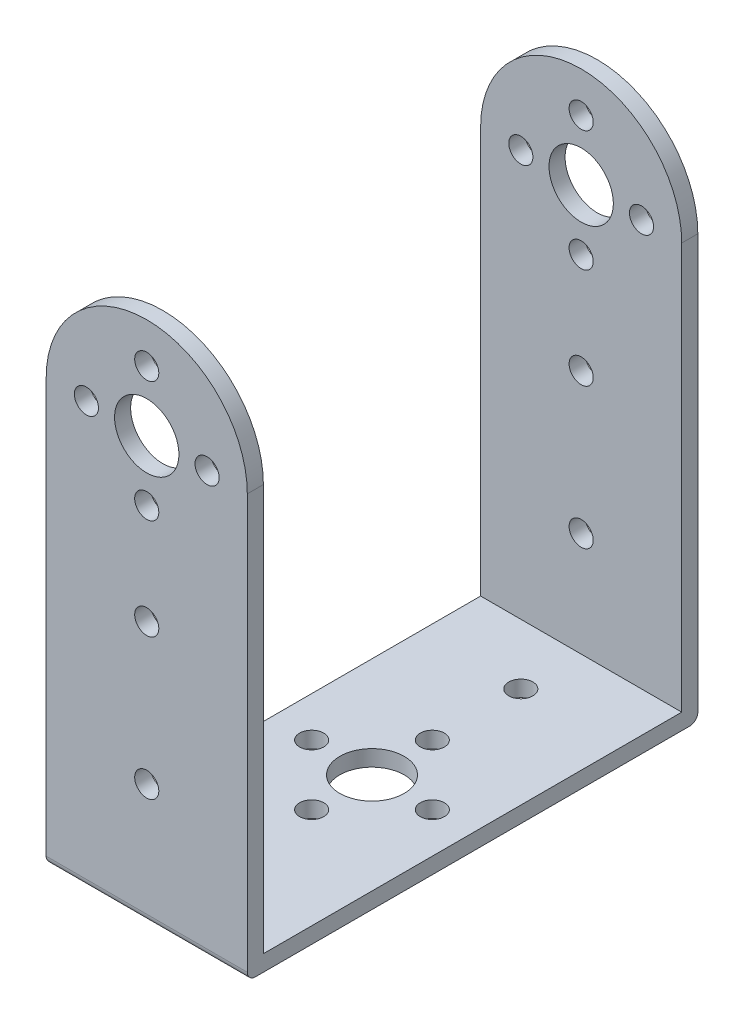
ISO-10303-21;
HEADER;
FILE_DESCRIPTION(('STEP AP214'),'2;1');
FILE_NAME('part.step','',(''),(''),'','','');
FILE_SCHEMA(('AUTOMOTIVE_DESIGN { 1 0 10303 214 1 1 1 1 }'));
ENDSEC;
DATA;
#1=APPLICATION_CONTEXT('core data for automotive mechanical design processes');
#2=APPLICATION_PROTOCOL_DEFINITION('international standard','automotive_design',2000,#1);
#3=PRODUCT_CONTEXT('',#1,'mechanical');
#4=PRODUCT('Part','Part','',(#3));
#5=PRODUCT_RELATED_PRODUCT_CATEGORY('part','',(#4));
#6=PRODUCT_DEFINITION_FORMATION('','',#4);
#7=PRODUCT_DEFINITION_CONTEXT('part definition',#1,'design');
#8=PRODUCT_DEFINITION('design','',#6,#7);
#9=PRODUCT_DEFINITION_SHAPE('','',#8);
#10=(LENGTH_UNIT() NAMED_UNIT(*) SI_UNIT(.MILLI.,.METRE.));
#11=(NAMED_UNIT(*) PLANE_ANGLE_UNIT() SI_UNIT($,.RADIAN.));
#12=(NAMED_UNIT(*) SI_UNIT($,.STERADIAN.) SOLID_ANGLE_UNIT());
#13=UNCERTAINTY_MEASURE_WITH_UNIT(LENGTH_MEASURE(1.E-05),#10,'distance_accuracy_value','');
#14=(GEOMETRIC_REPRESENTATION_CONTEXT(3) GLOBAL_UNCERTAINTY_ASSIGNED_CONTEXT((#13)) GLOBAL_UNIT_ASSIGNED_CONTEXT((#10,
#11,#12)) REPRESENTATION_CONTEXT('',''));
#15=CARTESIAN_POINT('',(0.,0.,0.));
#16=DIRECTION('',(0.,0.,1.));
#17=DIRECTION('',(1.,0.,0.));
#18=AXIS2_PLACEMENT_3D('',#15,#16,#17);
#19=CARTESIAN_POINT('',(0.,-30.5,0.));
#20=DIRECTION('',(0.,1.,0.));
#21=DIRECTION('',(0.,0.,1.));
#22=AXIS2_PLACEMENT_3D('',#19,#20,#21);
#23=PLANE('',#22);
#24=CARTESIAN_POINT('',(0.,-30.5,9.5));
#25=DIRECTION('',(0.,-1.,0.));
#26=DIRECTION('',(0.,0.,-1.));
#27=AXIS2_PLACEMENT_3D('',#24,#25,#26);
#28=CIRCLE('',#27,1.5);
#29=CARTESIAN_POINT('',(0.,-30.5,8.));
#30=VERTEX_POINT('',#29);
#31=EDGE_CURVE('E341',#30,#30,#28,.T.);
#32=ORIENTED_EDGE('',*,*,#31,.T.);
#33=EDGE_LOOP('',(#32));
#34=FACE_BOUND('',#33,.T.);
#35=CARTESIAN_POINT('',(0.,-30.5,46.5));
#36=DIRECTION('',(0.,-1.,0.));
#37=DIRECTION('',(0.,0.,-1.));
#38=AXIS2_PLACEMENT_3D('',#35,#36,#37);
#39=CIRCLE('',#38,1.5);
#40=CARTESIAN_POINT('',(0.,-30.5,45.));
#41=VERTEX_POINT('',#40);
#42=EDGE_CURVE('E335',#41,#41,#39,.T.);
#43=ORIENTED_EDGE('',*,*,#42,.T.);
#44=EDGE_LOOP('',(#43));
#45=FACE_BOUND('',#44,.T.);
#46=CARTESIAN_POINT('',(0.,-30.5,20.5));
#47=DIRECTION('',(0.,-1.,0.));
#48=DIRECTION('',(0.,0.,-1.));
#49=AXIS2_PLACEMENT_3D('',#46,#47,#48);
#50=CIRCLE('',#49,1.5);
#51=CARTESIAN_POINT('',(0.,-30.5,19.));
#52=VERTEX_POINT('',#51);
#53=EDGE_CURVE('E329',#52,#52,#50,.T.);
#54=ORIENTED_EDGE('',*,*,#53,.T.);
#55=EDGE_LOOP('',(#54));
#56=FACE_BOUND('',#55,.T.);
#57=CARTESIAN_POINT('',(7.5,-30.5,28.));
#58=DIRECTION('',(0.,-1.,0.));
#59=DIRECTION('',(0.,0.,-1.));
#60=AXIS2_PLACEMENT_3D('',#57,#58,#59);
#61=CIRCLE('',#60,1.5);
#62=CARTESIAN_POINT('',(7.5,-30.5,26.5));
#63=VERTEX_POINT('',#62);
#64=EDGE_CURVE('E323',#63,#63,#61,.T.);
#65=ORIENTED_EDGE('',*,*,#64,.T.);
#66=EDGE_LOOP('',(#65));
#67=FACE_BOUND('',#66,.T.);
#68=CARTESIAN_POINT('',(0.,-30.5,35.5));
#69=DIRECTION('',(0.,-1.,0.));
#70=DIRECTION('',(0.,0.,-1.));
#71=AXIS2_PLACEMENT_3D('',#68,#69,#70);
#72=CIRCLE('',#71,1.5);
#73=CARTESIAN_POINT('',(0.,-30.5,34.));
#74=VERTEX_POINT('',#73);
#75=EDGE_CURVE('E317',#74,#74,#72,.T.);
#76=ORIENTED_EDGE('',*,*,#75,.T.);
#77=EDGE_LOOP('',(#76));
#78=FACE_BOUND('',#77,.T.);
#79=CARTESIAN_POINT('',(-7.5,-30.5,28.));
#80=DIRECTION('',(0.,-1.,0.));
#81=DIRECTION('',(0.,0.,-1.));
#82=AXIS2_PLACEMENT_3D('',#79,#80,#81);
#83=CIRCLE('',#82,1.5);
#84=CARTESIAN_POINT('',(-7.5,-30.5,26.5));
#85=VERTEX_POINT('',#84);
#86=EDGE_CURVE('E311',#85,#85,#83,.T.);
#87=ORIENTED_EDGE('',*,*,#86,.T.);
#88=EDGE_LOOP('',(#87));
#89=FACE_BOUND('',#88,.T.);
#90=CARTESIAN_POINT('',(0.,-30.5,28.));
#91=DIRECTION('',(0.,-1.,0.));
#92=DIRECTION('',(0.,0.,-1.));
#93=AXIS2_PLACEMENT_3D('',#90,#91,#92);
#94=CIRCLE('',#93,4.);
#95=CARTESIAN_POINT('',(0.,-30.5,24.));
#96=VERTEX_POINT('',#95);
#97=EDGE_CURVE('E290',#96,#96,#94,.T.);
#98=ORIENTED_EDGE('',*,*,#97,.T.);
#99=EDGE_LOOP('',(#98));
#100=FACE_BOUND('',#99,.T.);
#101=DIRECTION('',(0.,0.,-1.));
#102=VECTOR('',#101,1.);
#103=CARTESIAN_POINT('',(-12.5,-30.5,0.));
#104=LINE('',#103,#102);
#105=CARTESIAN_POINT('',(-12.5,-30.5,54.));
#106=VERTEX_POINT('',#105);
#107=CARTESIAN_POINT('',(-12.5,-30.5,2.));
#108=VERTEX_POINT('',#107);
#109=EDGE_CURVE('E137',#106,#108,#104,.T.);
#110=ORIENTED_EDGE('',*,*,#109,.F.);
#111=DIRECTION('',(1.,0.,0.));
#112=VECTOR('',#111,1.);
#113=CARTESIAN_POINT('',(0.,-30.5,54.));
#114=LINE('',#113,#112);
#115=CARTESIAN_POINT('',(12.5,-30.5,54.));
#116=VERTEX_POINT('',#115);
#117=EDGE_CURVE('E215',#106,#116,#114,.T.);
#118=ORIENTED_EDGE('',*,*,#117,.T.);
#119=DIRECTION('',(0.,0.,1.));
#120=VECTOR('',#119,1.);
#121=CARTESIAN_POINT('',(12.5,-30.5,0.));
#122=LINE('',#121,#120);
#123=CARTESIAN_POINT('',(12.5,-30.5,2.));
#124=VERTEX_POINT('',#123);
#125=EDGE_CURVE('E122',#124,#116,#122,.T.);
#126=ORIENTED_EDGE('',*,*,#125,.F.);
#127=DIRECTION('',(-1.,0.,0.));
#128=VECTOR('',#127,1.);
#129=CARTESIAN_POINT('',(0.,-30.5,2.));
#130=LINE('',#129,#128);
#131=EDGE_CURVE('E144',#124,#108,#130,.T.);
#132=ORIENTED_EDGE('',*,*,#131,.T.);
#133=EDGE_LOOP('',(#110,#118,#126,#132));
#134=FACE_BOUND('',#133,.T.);
#135=ADVANCED_FACE('F36',(#34,#45,#56,#67,#78,#89,#100,#134),#23,.T.);
#136=CARTESIAN_POINT('',(12.5,0.,2.));
#137=DIRECTION('',(-1.,0.,0.));
#138=DIRECTION('',(0.,0.,1.));
#139=AXIS2_PLACEMENT_3D('',#136,#137,#138);
#140=PLANE('',#139);
#141=DIRECTION('',(0.,-1.,0.));
#142=VECTOR('',#141,1.);
#143=CARTESIAN_POINT('',(12.5,-30.5,56.));
#144=LINE('',#143,#142);
#145=CARTESIAN_POINT('',(12.5,20.,56.));
#146=VERTEX_POINT('',#145);
#147=CARTESIAN_POINT('',(12.5,-31.5,56.));
#148=VERTEX_POINT('',#147);
#149=EDGE_CURVE('E113',#146,#148,#144,.T.);
#150=ORIENTED_EDGE('',*,*,#149,.T.);
#151=CARTESIAN_POINT('',(12.5,-31.5,55.));
#152=DIRECTION('',(-1.,0.,0.));
#153=DIRECTION('',(0.,0.,1.));
#154=AXIS2_PLACEMENT_3D('',#151,#152,#153);
#155=CIRCLE('',#154,1.);
#156=CARTESIAN_POINT('',(12.5,-32.5,55.));
#157=VERTEX_POINT('',#156);
#158=EDGE_CURVE('E44',#148,#157,#155,.F.);
#159=ORIENTED_EDGE('',*,*,#158,.T.);
#160=DIRECTION('',(0.,0.,-1.));
#161=VECTOR('',#160,1.);
#162=CARTESIAN_POINT('',(12.5,-32.5,2.));
#163=LINE('',#162,#161);
#164=CARTESIAN_POINT('',(12.5,-32.5,1.));
#165=VERTEX_POINT('',#164);
#166=EDGE_CURVE('E178',#157,#165,#163,.T.);
#167=ORIENTED_EDGE('',*,*,#166,.T.);
#168=CARTESIAN_POINT('',(12.5,-31.5,1.));
#169=DIRECTION('',(-1.,0.,0.));
#170=DIRECTION('',(0.,0.,1.));
#171=AXIS2_PLACEMENT_3D('',#168,#169,#170);
#172=CIRCLE('',#171,1.);
#173=CARTESIAN_POINT('',(12.5,-31.5,0.));
#174=VERTEX_POINT('',#173);
#175=EDGE_CURVE('E51',#165,#174,#172,.F.);
#176=ORIENTED_EDGE('',*,*,#175,.T.);
#177=DIRECTION('',(0.,1.,0.));
#178=VECTOR('',#177,1.);
#179=CARTESIAN_POINT('',(12.5,0.,0.));
#180=LINE('',#179,#178);
#181=CARTESIAN_POINT('',(12.5,20.,0.));
#182=VERTEX_POINT('',#181);
#183=EDGE_CURVE('E199',#174,#182,#180,.T.);
#184=ORIENTED_EDGE('',*,*,#183,.T.);
#185=DIRECTION('',(0.,0.,-1.));
#186=VECTOR('',#185,1.);
#187=CARTESIAN_POINT('',(12.5,20.,2.));
#188=LINE('',#187,#186);
#189=CARTESIAN_POINT('',(12.5,20.,2.));
#190=VERTEX_POINT('',#189);
#191=EDGE_CURVE('E212',#190,#182,#188,.T.);
#192=ORIENTED_EDGE('',*,*,#191,.F.);
#193=DIRECTION('',(0.,1.,0.));
#194=VECTOR('',#193,1.);
#195=CARTESIAN_POINT('',(12.5,0.,2.));
#196=LINE('',#195,#194);
#197=EDGE_CURVE('E171',#124,#190,#196,.T.);
#198=ORIENTED_EDGE('',*,*,#197,.F.);
#199=ORIENTED_EDGE('',*,*,#125,.T.);
#200=DIRECTION('',(0.,1.,0.));
#201=VECTOR('',#200,1.);
#202=CARTESIAN_POINT('',(12.5,0.,54.));
#203=LINE('',#202,#201);
#204=CARTESIAN_POINT('',(12.5,20.,54.));
#205=VERTEX_POINT('',#204);
#206=EDGE_CURVE('E135',#116,#205,#203,.T.);
#207=ORIENTED_EDGE('',*,*,#206,.T.);
#208=DIRECTION('',(0.,0.,-1.));
#209=VECTOR('',#208,1.);
#210=CARTESIAN_POINT('',(12.5,20.,56.));
#211=LINE('',#210,#209);
#212=EDGE_CURVE('E128',#146,#205,#211,.T.);
#213=ORIENTED_EDGE('',*,*,#212,.F.);
#214=EDGE_LOOP('',(#150,#159,#167,#176,#184,#192,#198,#199,#207,#213));
#215=FACE_BOUND('',#214,.T.);
#216=ADVANCED_FACE('F133',(#215),#140,.F.);
#217=CARTESIAN_POINT('',(0.,20.,2.));
#218=DIRECTION('',(0.,0.,-1.));
#219=DIRECTION('',(-1.,0.,0.));
#220=AXIS2_PLACEMENT_3D('',#217,#218,#219);
#221=CYLINDRICAL_SURFACE('',#220,12.5);
#222=CARTESIAN_POINT('',(0.,20.,0.));
#223=DIRECTION('',(0.,0.,1.));
#224=DIRECTION('',(1.,0.,0.));
#225=AXIS2_PLACEMENT_3D('',#222,#223,#224);
#226=CIRCLE('',#225,12.5);
#227=CARTESIAN_POINT('',(-12.5,20.,0.));
#228=VERTEX_POINT('',#227);
#229=EDGE_CURVE('E201',#182,#228,#226,.T.);
#230=ORIENTED_EDGE('',*,*,#229,.T.);
#231=DIRECTION('',(0.,0.,-1.));
#232=VECTOR('',#231,1.);
#233=CARTESIAN_POINT('',(-12.5,20.,2.));
#234=LINE('',#233,#232);
#235=CARTESIAN_POINT('',(-12.5,20.,2.));
#236=VERTEX_POINT('',#235);
#237=EDGE_CURVE('E209',#236,#228,#234,.T.);
#238=ORIENTED_EDGE('',*,*,#237,.F.);
#239=CARTESIAN_POINT('',(0.,20.,2.));
#240=DIRECTION('',(0.,0.,1.));
#241=DIRECTION('',(1.,0.,0.));
#242=AXIS2_PLACEMENT_3D('',#239,#240,#241);
#243=CIRCLE('',#242,12.5);
#244=EDGE_CURVE('E173',#190,#236,#243,.T.);
#245=ORIENTED_EDGE('',*,*,#244,.F.);
#246=ORIENTED_EDGE('',*,*,#191,.T.);
#247=EDGE_LOOP('',(#230,#238,#245,#246));
#248=FACE_BOUND('',#247,.T.);
#249=ADVANCED_FACE('F248',(#248),#221,.T.);
#250=CARTESIAN_POINT('',(-12.5,0.,2.));
#251=DIRECTION('',(-1.,0.,0.));
#252=DIRECTION('',(0.,0.,1.));
#253=AXIS2_PLACEMENT_3D('',#250,#251,#252);
#254=PLANE('',#253);
#255=DIRECTION('',(0.,0.,-1.));
#256=VECTOR('',#255,1.);
#257=CARTESIAN_POINT('',(-12.5,-32.5,2.));
#258=LINE('',#257,#256);
#259=CARTESIAN_POINT('',(-12.5,-32.5,55.));
#260=VERTEX_POINT('',#259);
#261=CARTESIAN_POINT('',(-12.5,-32.5,1.));
#262=VERTEX_POINT('',#261);
#263=EDGE_CURVE('E206',#260,#262,#258,.T.);
#264=ORIENTED_EDGE('',*,*,#263,.F.);
#265=CARTESIAN_POINT('',(-12.5,-31.5,55.));
#266=DIRECTION('',(-1.,0.,0.));
#267=DIRECTION('',(0.,0.,1.));
#268=AXIS2_PLACEMENT_3D('',#265,#266,#267);
#269=CIRCLE('',#268,1.);
#270=CARTESIAN_POINT('',(-12.5,-31.5,56.));
#271=VERTEX_POINT('',#270);
#272=EDGE_CURVE('E225',#260,#271,#269,.T.);
#273=ORIENTED_EDGE('',*,*,#272,.T.);
#274=DIRECTION('',(0.,-1.,0.));
#275=VECTOR('',#274,1.);
#276=CARTESIAN_POINT('',(-12.5,-30.5,56.));
#277=LINE('',#276,#275);
#278=CARTESIAN_POINT('',(-12.5,20.,56.));
#279=VERTEX_POINT('',#278);
#280=EDGE_CURVE('E121',#279,#271,#277,.T.);
#281=ORIENTED_EDGE('',*,*,#280,.F.);
#282=DIRECTION('',(0.,0.,-1.));
#283=VECTOR('',#282,1.);
#284=CARTESIAN_POINT('',(-12.5,20.,56.));
#285=LINE('',#284,#283);
#286=CARTESIAN_POINT('',(-12.5,20.,54.));
#287=VERTEX_POINT('',#286);
#288=EDGE_CURVE('E130',#279,#287,#285,.T.);
#289=ORIENTED_EDGE('',*,*,#288,.T.);
#290=DIRECTION('',(0.,1.,0.));
#291=VECTOR('',#290,1.);
#292=CARTESIAN_POINT('',(-12.5,0.,54.));
#293=LINE('',#292,#291);
#294=EDGE_CURVE('E261',#106,#287,#293,.T.);
#295=ORIENTED_EDGE('',*,*,#294,.F.);
#296=ORIENTED_EDGE('',*,*,#109,.T.);
#297=DIRECTION('',(0.,1.,0.));
#298=VECTOR('',#297,1.);
#299=CARTESIAN_POINT('',(-12.5,0.,2.));
#300=LINE('',#299,#298);
#301=EDGE_CURVE('E176',#108,#236,#300,.T.);
#302=ORIENTED_EDGE('',*,*,#301,.T.);
#303=ORIENTED_EDGE('',*,*,#237,.T.);
#304=DIRECTION('',(0.,1.,0.));
#305=VECTOR('',#304,1.);
#306=CARTESIAN_POINT('',(-12.5,0.,0.));
#307=LINE('',#306,#305);
#308=CARTESIAN_POINT('',(-12.5,-31.5,0.));
#309=VERTEX_POINT('',#308);
#310=EDGE_CURVE('E153',#309,#228,#307,.T.);
#311=ORIENTED_EDGE('',*,*,#310,.F.);
#312=CARTESIAN_POINT('',(-12.5,-31.5,1.));
#313=DIRECTION('',(-1.,0.,0.));
#314=DIRECTION('',(0.,0.,1.));
#315=AXIS2_PLACEMENT_3D('',#312,#313,#314);
#316=CIRCLE('',#315,1.);
#317=EDGE_CURVE('E223',#309,#262,#316,.T.);
#318=ORIENTED_EDGE('',*,*,#317,.T.);
#319=EDGE_LOOP('',(#264,#273,#281,#289,#295,#296,#302,#303,#311,#318));
#320=FACE_BOUND('',#319,.T.);
#321=ADVANCED_FACE('F237',(#320),#254,.T.);
#322=CARTESIAN_POINT('',(0.,20.,2.));
#323=DIRECTION('',(0.,0.,-1.));
#324=DIRECTION('',(-1.,0.,0.));
#325=AXIS2_PLACEMENT_3D('',#322,#323,#324);
#326=CYLINDRICAL_SURFACE('',#325,4.);
#327=CARTESIAN_POINT('',(0.,20.,2.));
#328=DIRECTION('',(0.,0.,1.));
#329=DIRECTION('',(1.,0.,0.));
#330=AXIS2_PLACEMENT_3D('',#327,#328,#329);
#331=CIRCLE('',#330,4.);
#332=CARTESIAN_POINT('',(4.,20.,2.));
#333=VERTEX_POINT('',#332);
#334=EDGE_CURVE('E168',#333,#333,#331,.T.);
#335=ORIENTED_EDGE('',*,*,#334,.T.);
#336=EDGE_LOOP('',(#335));
#337=FACE_BOUND('',#336,.T.);
#338=CARTESIAN_POINT('',(0.,20.,0.));
#339=DIRECTION('',(0.,0.,1.));
#340=DIRECTION('',(1.,0.,0.));
#341=AXIS2_PLACEMENT_3D('',#338,#339,#340);
#342=CIRCLE('',#341,4.);
#343=CARTESIAN_POINT('',(4.,20.,0.));
#344=VERTEX_POINT('',#343);
#345=EDGE_CURVE('E196',#344,#344,#342,.T.);
#346=ORIENTED_EDGE('',*,*,#345,.F.);
#347=EDGE_LOOP('',(#346));
#348=FACE_BOUND('',#347,.T.);
#349=ADVANCED_FACE('F408',(#337,#348),#326,.F.);
#350=CARTESIAN_POINT('',(-7.5,20.,2.));
#351=DIRECTION('',(0.,0.,-1.));
#352=DIRECTION('',(-1.,0.,0.));
#353=AXIS2_PLACEMENT_3D('',#350,#351,#352);
#354=CYLINDRICAL_SURFACE('',#353,1.5);
#355=CARTESIAN_POINT('',(-7.5,20.,2.));
#356=DIRECTION('',(0.,0.,1.));
#357=DIRECTION('',(1.,0.,0.));
#358=AXIS2_PLACEMENT_3D('',#355,#356,#357);
#359=CIRCLE('',#358,1.5);
#360=CARTESIAN_POINT('',(-6.,20.,2.));
#361=VERTEX_POINT('',#360);
#362=EDGE_CURVE('E165',#361,#361,#359,.T.);
#363=ORIENTED_EDGE('',*,*,#362,.T.);
#364=EDGE_LOOP('',(#363));
#365=FACE_BOUND('',#364,.T.);
#366=CARTESIAN_POINT('',(-7.5,20.,0.));
#367=DIRECTION('',(0.,0.,1.));
#368=DIRECTION('',(1.,0.,0.));
#369=AXIS2_PLACEMENT_3D('',#366,#367,#368);
#370=CIRCLE('',#369,1.5);
#371=CARTESIAN_POINT('',(-6.,20.,0.));
#372=VERTEX_POINT('',#371);
#373=EDGE_CURVE('E193',#372,#372,#370,.T.);
#374=ORIENTED_EDGE('',*,*,#373,.F.);
#375=EDGE_LOOP('',(#374));
#376=FACE_BOUND('',#375,.T.);
#377=ADVANCED_FACE('F413',(#365,#376),#354,.F.);
#378=CARTESIAN_POINT('',(0.,27.5,2.));
#379=DIRECTION('',(0.,0.,-1.));
#380=DIRECTION('',(-1.,0.,0.));
#381=AXIS2_PLACEMENT_3D('',#378,#379,#380);
#382=CYLINDRICAL_SURFACE('',#381,1.5);
#383=CARTESIAN_POINT('',(0.,27.5,2.));
#384=DIRECTION('',(0.,0.,1.));
#385=DIRECTION('',(1.,0.,0.));
#386=AXIS2_PLACEMENT_3D('',#383,#384,#385);
#387=CIRCLE('',#386,1.5);
#388=CARTESIAN_POINT('',(1.50000000000003,27.5,2.));
#389=VERTEX_POINT('',#388);
#390=EDGE_CURVE('E162',#389,#389,#387,.T.);
#391=ORIENTED_EDGE('',*,*,#390,.T.);
#392=EDGE_LOOP('',(#391));
#393=FACE_BOUND('',#392,.T.);
#394=CARTESIAN_POINT('',(0.,27.5,0.));
#395=DIRECTION('',(0.,0.,1.));
#396=DIRECTION('',(1.,0.,0.));
#397=AXIS2_PLACEMENT_3D('',#394,#395,#396);
#398=CIRCLE('',#397,1.5);
#399=CARTESIAN_POINT('',(1.50000000000003,27.5,0.));
#400=VERTEX_POINT('',#399);
#401=EDGE_CURVE('E190',#400,#400,#398,.T.);
#402=ORIENTED_EDGE('',*,*,#401,.F.);
#403=EDGE_LOOP('',(#402));
#404=FACE_BOUND('',#403,.T.);
#405=ADVANCED_FACE('F417',(#393,#404),#382,.F.);
#406=CARTESIAN_POINT('',(7.5,20.,2.));
#407=DIRECTION('',(0.,0.,-1.));
#408=DIRECTION('',(-1.,0.,0.));
#409=AXIS2_PLACEMENT_3D('',#406,#407,#408);
#410=CYLINDRICAL_SURFACE('',#409,1.5);
#411=CARTESIAN_POINT('',(7.5,20.,2.));
#412=DIRECTION('',(0.,0.,1.));
#413=DIRECTION('',(1.,0.,0.));
#414=AXIS2_PLACEMENT_3D('',#411,#412,#413);
#415=CIRCLE('',#414,1.5);
#416=CARTESIAN_POINT('',(9.,20.,2.));
#417=VERTEX_POINT('',#416);
#418=EDGE_CURVE('E159',#417,#417,#415,.T.);
#419=ORIENTED_EDGE('',*,*,#418,.T.);
#420=EDGE_LOOP('',(#419));
#421=FACE_BOUND('',#420,.T.);
#422=CARTESIAN_POINT('',(7.5,20.,0.));
#423=DIRECTION('',(0.,0.,1.));
#424=DIRECTION('',(1.,0.,0.));
#425=AXIS2_PLACEMENT_3D('',#422,#423,#424);
#426=CIRCLE('',#425,1.5);
#427=CARTESIAN_POINT('',(9.,20.,0.));
#428=VERTEX_POINT('',#427);
#429=EDGE_CURVE('E187',#428,#428,#426,.T.);
#430=ORIENTED_EDGE('',*,*,#429,.F.);
#431=EDGE_LOOP('',(#430));
#432=FACE_BOUND('',#431,.T.);
#433=ADVANCED_FACE('F421',(#421,#432),#410,.F.);
#434=CARTESIAN_POINT('',(0.,12.5,2.));
#435=DIRECTION('',(0.,0.,-1.));
#436=DIRECTION('',(-1.,0.,0.));
#437=AXIS2_PLACEMENT_3D('',#434,#435,#436);
#438=CYLINDRICAL_SURFACE('',#437,1.5);
#439=CARTESIAN_POINT('',(0.,12.5,2.));
#440=DIRECTION('',(0.,0.,1.));
#441=DIRECTION('',(1.,0.,0.));
#442=AXIS2_PLACEMENT_3D('',#439,#440,#441);
#443=CIRCLE('',#442,1.5);
#444=CARTESIAN_POINT('',(1.49999999999992,12.5,2.));
#445=VERTEX_POINT('',#444);
#446=EDGE_CURVE('E156',#445,#445,#443,.T.);
#447=ORIENTED_EDGE('',*,*,#446,.T.);
#448=EDGE_LOOP('',(#447));
#449=FACE_BOUND('',#448,.T.);
#450=CARTESIAN_POINT('',(0.,12.5,0.));
#451=DIRECTION('',(0.,0.,1.));
#452=DIRECTION('',(1.,0.,0.));
#453=AXIS2_PLACEMENT_3D('',#450,#451,#452);
#454=CIRCLE('',#453,1.5);
#455=CARTESIAN_POINT('',(1.49999999999992,12.5,0.));
#456=VERTEX_POINT('',#455);
#457=EDGE_CURVE('E184',#456,#456,#454,.T.);
#458=ORIENTED_EDGE('',*,*,#457,.F.);
#459=EDGE_LOOP('',(#458));
#460=FACE_BOUND('',#459,.T.);
#461=ADVANCED_FACE('F425',(#449,#460),#438,.F.);
#462=CARTESIAN_POINT('',(0.,-17.5,2.));
#463=DIRECTION('',(0.,0.,-1.));
#464=DIRECTION('',(-1.,0.,0.));
#465=AXIS2_PLACEMENT_3D('',#462,#463,#464);
#466=CYLINDRICAL_SURFACE('',#465,1.5);
#467=CARTESIAN_POINT('',(0.,-17.5,2.));
#468=DIRECTION('',(0.,0.,1.));
#469=DIRECTION('',(1.,0.,0.));
#470=AXIS2_PLACEMENT_3D('',#467,#468,#469);
#471=CIRCLE('',#470,1.5);
#472=CARTESIAN_POINT('',(1.50000000000001,-17.5,2.));
#473=VERTEX_POINT('',#472);
#474=EDGE_CURVE('E152',#473,#473,#471,.T.);
#475=ORIENTED_EDGE('',*,*,#474,.T.);
#476=EDGE_LOOP('',(#475));
#477=FACE_BOUND('',#476,.T.);
#478=CARTESIAN_POINT('',(0.,-17.5,0.));
#479=DIRECTION('',(0.,0.,1.));
#480=DIRECTION('',(1.,0.,0.));
#481=AXIS2_PLACEMENT_3D('',#478,#479,#480);
#482=CIRCLE('',#481,1.5);
#483=CARTESIAN_POINT('',(1.50000000000001,-17.5,0.));
#484=VERTEX_POINT('',#483);
#485=EDGE_CURVE('E181',#484,#484,#482,.T.);
#486=ORIENTED_EDGE('',*,*,#485,.F.);
#487=EDGE_LOOP('',(#486));
#488=FACE_BOUND('',#487,.T.);
#489=ADVANCED_FACE('F429',(#477,#488),#466,.F.);
#490=CARTESIAN_POINT('',(0.,0.,2.));
#491=DIRECTION('',(0.,0.,-1.));
#492=DIRECTION('',(-1.,0.,0.));
#493=AXIS2_PLACEMENT_3D('',#490,#491,#492);
#494=CYLINDRICAL_SURFACE('',#493,1.5);
#495=CARTESIAN_POINT('',(0.,0.,2.));
#496=DIRECTION('',(0.,0.,1.));
#497=DIRECTION('',(1.,0.,0.));
#498=AXIS2_PLACEMENT_3D('',#495,#496,#497);
#499=CIRCLE('',#498,1.5);
#500=CARTESIAN_POINT('',(1.5,0.,2.));
#501=VERTEX_POINT('',#500);
#502=EDGE_CURVE('E149',#501,#501,#499,.T.);
#503=ORIENTED_EDGE('',*,*,#502,.T.);
#504=EDGE_LOOP('',(#503));
#505=FACE_BOUND('',#504,.T.);
#506=CARTESIAN_POINT('',(0.,0.,0.));
#507=DIRECTION('',(0.,0.,1.));
#508=DIRECTION('',(1.,0.,0.));
#509=AXIS2_PLACEMENT_3D('',#506,#507,#508);
#510=CIRCLE('',#509,1.5);
#511=CARTESIAN_POINT('',(1.5,0.,0.));
#512=VERTEX_POINT('',#511);
#513=EDGE_CURVE('E148',#512,#512,#510,.T.);
#514=ORIENTED_EDGE('',*,*,#513,.F.);
#515=EDGE_LOOP('',(#514));
#516=FACE_BOUND('',#515,.T.);
#517=ADVANCED_FACE('F361',(#505,#516),#494,.F.);
#518=CARTESIAN_POINT('',(0.,-32.5,2.));
#519=DIRECTION('',(0.,-1.,0.));
#520=DIRECTION('',(0.,0.,-1.));
#521=AXIS2_PLACEMENT_3D('',#518,#519,#520);
#522=PLANE('',#521);
#523=CARTESIAN_POINT('',(0.,-32.5,9.5));
#524=DIRECTION('',(0.,-1.,0.));
#525=DIRECTION('',(0.,0.,-1.));
#526=AXIS2_PLACEMENT_3D('',#523,#524,#525);
#527=CIRCLE('',#526,1.5);
#528=CARTESIAN_POINT('',(0.,-32.5,8.));
#529=VERTEX_POINT('',#528);
#530=EDGE_CURVE('E344',#529,#529,#527,.T.);
#531=ORIENTED_EDGE('',*,*,#530,.F.);
#532=EDGE_LOOP('',(#531));
#533=FACE_BOUND('',#532,.T.);
#534=CARTESIAN_POINT('',(0.,-32.5,46.5));
#535=DIRECTION('',(0.,-1.,0.));
#536=DIRECTION('',(0.,0.,-1.));
#537=AXIS2_PLACEMENT_3D('',#534,#535,#536);
#538=CIRCLE('',#537,1.5);
#539=CARTESIAN_POINT('',(0.,-32.5,45.));
#540=VERTEX_POINT('',#539);
#541=EDGE_CURVE('E338',#540,#540,#538,.T.);
#542=ORIENTED_EDGE('',*,*,#541,.F.);
#543=EDGE_LOOP('',(#542));
#544=FACE_BOUND('',#543,.T.);
#545=CARTESIAN_POINT('',(0.,-32.5,20.5));
#546=DIRECTION('',(0.,-1.,0.));
#547=DIRECTION('',(0.,0.,-1.));
#548=AXIS2_PLACEMENT_3D('',#545,#546,#547);
#549=CIRCLE('',#548,1.5);
#550=CARTESIAN_POINT('',(0.,-32.5,19.));
#551=VERTEX_POINT('',#550);
#552=EDGE_CURVE('E332',#551,#551,#549,.T.);
#553=ORIENTED_EDGE('',*,*,#552,.F.);
#554=EDGE_LOOP('',(#553));
#555=FACE_BOUND('',#554,.T.);
#556=CARTESIAN_POINT('',(7.5,-32.5,28.));
#557=DIRECTION('',(0.,-1.,0.));
#558=DIRECTION('',(0.,0.,-1.));
#559=AXIS2_PLACEMENT_3D('',#556,#557,#558);
#560=CIRCLE('',#559,1.5);
#561=CARTESIAN_POINT('',(7.5,-32.5,26.5));
#562=VERTEX_POINT('',#561);
#563=EDGE_CURVE('E326',#562,#562,#560,.T.);
#564=ORIENTED_EDGE('',*,*,#563,.F.);
#565=EDGE_LOOP('',(#564));
#566=FACE_BOUND('',#565,.T.);
#567=CARTESIAN_POINT('',(0.,-32.5,35.5));
#568=DIRECTION('',(0.,-1.,0.));
#569=DIRECTION('',(0.,0.,-1.));
#570=AXIS2_PLACEMENT_3D('',#567,#568,#569);
#571=CIRCLE('',#570,1.5);
#572=CARTESIAN_POINT('',(0.,-32.5,34.));
#573=VERTEX_POINT('',#572);
#574=EDGE_CURVE('E320',#573,#573,#571,.T.);
#575=ORIENTED_EDGE('',*,*,#574,.F.);
#576=EDGE_LOOP('',(#575));
#577=FACE_BOUND('',#576,.T.);
#578=CARTESIAN_POINT('',(-7.5,-32.5,28.));
#579=DIRECTION('',(0.,-1.,0.));
#580=DIRECTION('',(0.,0.,-1.));
#581=AXIS2_PLACEMENT_3D('',#578,#579,#580);
#582=CIRCLE('',#581,1.5);
#583=CARTESIAN_POINT('',(-7.5,-32.5,26.5));
#584=VERTEX_POINT('',#583);
#585=EDGE_CURVE('E314',#584,#584,#582,.T.);
#586=ORIENTED_EDGE('',*,*,#585,.F.);
#587=EDGE_LOOP('',(#586));
#588=FACE_BOUND('',#587,.T.);
#589=CARTESIAN_POINT('',(0.,-32.5,28.));
#590=DIRECTION('',(0.,-1.,0.));
#591=DIRECTION('',(0.,0.,-1.));
#592=AXIS2_PLACEMENT_3D('',#589,#590,#591);
#593=CIRCLE('',#592,4.);
#594=CARTESIAN_POINT('',(0.,-32.5,24.));
#595=VERTEX_POINT('',#594);
#596=EDGE_CURVE('E308',#595,#595,#593,.T.);
#597=ORIENTED_EDGE('',*,*,#596,.F.);
#598=EDGE_LOOP('',(#597));
#599=FACE_BOUND('',#598,.T.);
#600=ORIENTED_EDGE('',*,*,#166,.F.);
#601=DIRECTION('',(-1.,0.,0.));
#602=VECTOR('',#601,1.);
#603=CARTESIAN_POINT('',(0.,-32.5,55.));
#604=LINE('',#603,#602);
#605=EDGE_CURVE('E220',#157,#260,#604,.T.);
#606=ORIENTED_EDGE('',*,*,#605,.T.);
#607=ORIENTED_EDGE('',*,*,#263,.T.);
#608=DIRECTION('',(-1.,0.,0.));
#609=VECTOR('',#608,1.);
#610=CARTESIAN_POINT('',(12.5,-32.5,1.));
#611=LINE('',#610,#609);
#612=EDGE_CURVE('E218',#262,#165,#611,.F.);
#613=ORIENTED_EDGE('',*,*,#612,.T.);
#614=EDGE_LOOP('',(#600,#606,#607,#613));
#615=FACE_BOUND('',#614,.T.);
#616=ADVANCED_FACE('F232',(#533,#544,#555,#566,#577,#588,#599,#615),#522,.T.);
#617=CARTESIAN_POINT('',(0.,0.,2.));
#618=DIRECTION('',(0.,0.,1.));
#619=DIRECTION('',(1.,0.,0.));
#620=AXIS2_PLACEMENT_3D('',#617,#618,#619);
#621=PLANE('',#620);
#622=ORIENTED_EDGE('',*,*,#131,.F.);
#623=ORIENTED_EDGE('',*,*,#197,.T.);
#624=ORIENTED_EDGE('',*,*,#244,.T.);
#625=ORIENTED_EDGE('',*,*,#301,.F.);
#626=EDGE_LOOP('',(#622,#623,#624,#625));
#627=FACE_BOUND('',#626,.T.);
#628=ORIENTED_EDGE('',*,*,#502,.F.);
#629=EDGE_LOOP('',(#628));
#630=FACE_BOUND('',#629,.T.);
#631=ORIENTED_EDGE('',*,*,#474,.F.);
#632=EDGE_LOOP('',(#631));
#633=FACE_BOUND('',#632,.T.);
#634=ORIENTED_EDGE('',*,*,#446,.F.);
#635=EDGE_LOOP('',(#634));
#636=FACE_BOUND('',#635,.T.);
#637=ORIENTED_EDGE('',*,*,#418,.F.);
#638=EDGE_LOOP('',(#637));
#639=FACE_BOUND('',#638,.T.);
#640=ORIENTED_EDGE('',*,*,#390,.F.);
#641=EDGE_LOOP('',(#640));
#642=FACE_BOUND('',#641,.T.);
#643=ORIENTED_EDGE('',*,*,#362,.F.);
#644=EDGE_LOOP('',(#643));
#645=FACE_BOUND('',#644,.T.);
#646=ORIENTED_EDGE('',*,*,#334,.F.);
#647=EDGE_LOOP('',(#646));
#648=FACE_BOUND('',#647,.T.);
#649=ADVANCED_FACE('F253',(#627,#630,#633,#636,#639,#642,#645,#648),#621,.T.);
#650=CARTESIAN_POINT('',(0.,0.,0.));
#651=DIRECTION('',(0.,0.,1.));
#652=DIRECTION('',(1.,0.,0.));
#653=AXIS2_PLACEMENT_3D('',#650,#651,#652);
#654=PLANE('',#653);
#655=ORIENTED_EDGE('',*,*,#513,.T.);
#656=EDGE_LOOP('',(#655));
#657=FACE_BOUND('',#656,.T.);
#658=ORIENTED_EDGE('',*,*,#485,.T.);
#659=EDGE_LOOP('',(#658));
#660=FACE_BOUND('',#659,.T.);
#661=ORIENTED_EDGE('',*,*,#457,.T.);
#662=EDGE_LOOP('',(#661));
#663=FACE_BOUND('',#662,.T.);
#664=ORIENTED_EDGE('',*,*,#429,.T.);
#665=EDGE_LOOP('',(#664));
#666=FACE_BOUND('',#665,.T.);
#667=ORIENTED_EDGE('',*,*,#401,.T.);
#668=EDGE_LOOP('',(#667));
#669=FACE_BOUND('',#668,.T.);
#670=ORIENTED_EDGE('',*,*,#373,.T.);
#671=EDGE_LOOP('',(#670));
#672=FACE_BOUND('',#671,.T.);
#673=ORIENTED_EDGE('',*,*,#345,.T.);
#674=EDGE_LOOP('',(#673));
#675=FACE_BOUND('',#674,.T.);
#676=ORIENTED_EDGE('',*,*,#183,.F.);
#677=DIRECTION('',(-1.,0.,0.));
#678=VECTOR('',#677,1.);
#679=CARTESIAN_POINT('',(-12.5,-31.5,0.));
#680=LINE('',#679,#678);
#681=EDGE_CURVE('E11',#174,#309,#680,.T.);
#682=ORIENTED_EDGE('',*,*,#681,.T.);
#683=ORIENTED_EDGE('',*,*,#310,.T.);
#684=ORIENTED_EDGE('',*,*,#229,.F.);
#685=EDGE_LOOP('',(#676,#682,#683,#684));
#686=FACE_BOUND('',#685,.T.);
#687=ADVANCED_FACE('F242',(#657,#660,#663,#666,#669,#672,#675,#686),#654,.F.);
#688=CARTESIAN_POINT('',(-12.5,-30.5,56.));
#689=DIRECTION('',(0.,0.,1.));
#690=DIRECTION('',(1.,0.,0.));
#691=AXIS2_PLACEMENT_3D('',#688,#689,#690);
#692=PLANE('',#691);
#693=ORIENTED_EDGE('',*,*,#280,.T.);
#694=DIRECTION('',(-1.,0.,0.));
#695=VECTOR('',#694,1.);
#696=CARTESIAN_POINT('',(-12.5,-31.5,56.));
#697=LINE('',#696,#695);
#698=EDGE_CURVE('E59',#271,#148,#697,.F.);
#699=ORIENTED_EDGE('',*,*,#698,.T.);
#700=ORIENTED_EDGE('',*,*,#149,.F.);
#701=CARTESIAN_POINT('',(0.,20.,56.));
#702=DIRECTION('',(0.,0.,1.));
#703=DIRECTION('',(1.,0.,0.));
#704=AXIS2_PLACEMENT_3D('',#701,#702,#703);
#705=CIRCLE('',#704,12.5);
#706=EDGE_CURVE('E117',#146,#279,#705,.T.);
#707=ORIENTED_EDGE('',*,*,#706,.T.);
#708=EDGE_LOOP('',(#693,#699,#700,#707));
#709=FACE_BOUND('',#708,.T.);
#710=CARTESIAN_POINT('',(0.,0.,56.));
#711=DIRECTION('',(0.,0.,1.));
#712=DIRECTION('',(1.,0.,0.));
#713=AXIS2_PLACEMENT_3D('',#710,#711,#712);
#714=CIRCLE('',#713,1.5);
#715=CARTESIAN_POINT('',(1.5,0.,56.));
#716=VERTEX_POINT('',#715);
#717=EDGE_CURVE('E262',#716,#716,#714,.T.);
#718=ORIENTED_EDGE('',*,*,#717,.F.);
#719=EDGE_LOOP('',(#718));
#720=FACE_BOUND('',#719,.T.);
#721=CARTESIAN_POINT('',(0.,-17.5,56.));
#722=DIRECTION('',(0.,0.,1.));
#723=DIRECTION('',(1.,0.,0.));
#724=AXIS2_PLACEMENT_3D('',#721,#722,#723);
#725=CIRCLE('',#724,1.5);
#726=CARTESIAN_POINT('',(1.50000000000001,-17.5,56.));
#727=VERTEX_POINT('',#726);
#728=EDGE_CURVE('E265',#727,#727,#725,.T.);
#729=ORIENTED_EDGE('',*,*,#728,.F.);
#730=EDGE_LOOP('',(#729));
#731=FACE_BOUND('',#730,.T.);
#732=CARTESIAN_POINT('',(0.,12.5,56.));
#733=DIRECTION('',(0.,0.,1.));
#734=DIRECTION('',(1.,0.,0.));
#735=AXIS2_PLACEMENT_3D('',#732,#733,#734);
#736=CIRCLE('',#735,1.5);
#737=CARTESIAN_POINT('',(1.49999999999992,12.5,56.));
#738=VERTEX_POINT('',#737);
#739=EDGE_CURVE('E303',#738,#738,#736,.T.);
#740=ORIENTED_EDGE('',*,*,#739,.F.);
#741=EDGE_LOOP('',(#740));
#742=FACE_BOUND('',#741,.T.);
#743=CARTESIAN_POINT('',(7.5,20.,56.));
#744=DIRECTION('',(0.,0.,1.));
#745=DIRECTION('',(1.,0.,0.));
#746=AXIS2_PLACEMENT_3D('',#743,#744,#745);
#747=CIRCLE('',#746,1.5);
#748=CARTESIAN_POINT('',(9.,20.,56.));
#749=VERTEX_POINT('',#748);
#750=EDGE_CURVE('E300',#749,#749,#747,.T.);
#751=ORIENTED_EDGE('',*,*,#750,.F.);
#752=EDGE_LOOP('',(#751));
#753=FACE_BOUND('',#752,.T.);
#754=CARTESIAN_POINT('',(0.,27.5,56.));
#755=DIRECTION('',(0.,0.,1.));
#756=DIRECTION('',(1.,0.,0.));
#757=AXIS2_PLACEMENT_3D('',#754,#755,#756);
#758=CIRCLE('',#757,1.5);
#759=CARTESIAN_POINT('',(1.50000000000003,27.5,56.));
#760=VERTEX_POINT('',#759);
#761=EDGE_CURVE('E297',#760,#760,#758,.T.);
#762=ORIENTED_EDGE('',*,*,#761,.F.);
#763=EDGE_LOOP('',(#762));
#764=FACE_BOUND('',#763,.T.);
#765=CARTESIAN_POINT('',(-7.5,20.,56.));
#766=DIRECTION('',(0.,0.,1.));
#767=DIRECTION('',(1.,0.,0.));
#768=AXIS2_PLACEMENT_3D('',#765,#766,#767);
#769=CIRCLE('',#768,1.5);
#770=CARTESIAN_POINT('',(-6.,20.,56.));
#771=VERTEX_POINT('',#770);
#772=EDGE_CURVE('E294',#771,#771,#769,.T.);
#773=ORIENTED_EDGE('',*,*,#772,.F.);
#774=EDGE_LOOP('',(#773));
#775=FACE_BOUND('',#774,.T.);
#776=CARTESIAN_POINT('',(0.,20.,56.));
#777=DIRECTION('',(0.,0.,1.));
#778=DIRECTION('',(1.,0.,0.));
#779=AXIS2_PLACEMENT_3D('',#776,#777,#778);
#780=CIRCLE('',#779,4.);
#781=CARTESIAN_POINT('',(4.,20.,56.));
#782=VERTEX_POINT('',#781);
#783=EDGE_CURVE('E131',#782,#782,#780,.T.);
#784=ORIENTED_EDGE('',*,*,#783,.F.);
#785=EDGE_LOOP('',(#784));
#786=FACE_BOUND('',#785,.T.);
#787=ADVANCED_FACE('F115',(#709,#720,#731,#742,#753,#764,#775,#786),#692,.T.);
#788=CARTESIAN_POINT('',(0.,20.,56.));
#789=DIRECTION('',(0.,0.,-1.));
#790=DIRECTION('',(-1.,0.,0.));
#791=AXIS2_PLACEMENT_3D('',#788,#789,#790);
#792=CYLINDRICAL_SURFACE('',#791,12.5);
#793=CARTESIAN_POINT('',(0.,20.,54.));
#794=DIRECTION('',(0.,0.,1.));
#795=DIRECTION('',(1.,0.,0.));
#796=AXIS2_PLACEMENT_3D('',#793,#794,#795);
#797=CIRCLE('',#796,12.5);
#798=EDGE_CURVE('E263',#205,#287,#797,.T.);
#799=ORIENTED_EDGE('',*,*,#798,.T.);
#800=ORIENTED_EDGE('',*,*,#288,.F.);
#801=ORIENTED_EDGE('',*,*,#706,.F.);
#802=ORIENTED_EDGE('',*,*,#212,.T.);
#803=EDGE_LOOP('',(#799,#800,#801,#802));
#804=FACE_BOUND('',#803,.T.);
#805=ADVANCED_FACE('F127',(#804),#792,.T.);
#806=CARTESIAN_POINT('',(0.,20.,56.));
#807=DIRECTION('',(0.,0.,-1.));
#808=DIRECTION('',(-1.,0.,0.));
#809=AXIS2_PLACEMENT_3D('',#806,#807,#808);
#810=CYLINDRICAL_SURFACE('',#809,4.);
#811=ORIENTED_EDGE('',*,*,#783,.T.);
#812=EDGE_LOOP('',(#811));
#813=FACE_BOUND('',#812,.T.);
#814=CARTESIAN_POINT('',(0.,20.,54.));
#815=DIRECTION('',(0.,0.,1.));
#816=DIRECTION('',(1.,0.,0.));
#817=AXIS2_PLACEMENT_3D('',#814,#815,#816);
#818=CIRCLE('',#817,4.);
#819=CARTESIAN_POINT('',(4.,20.,54.));
#820=VERTEX_POINT('',#819);
#821=EDGE_CURVE('E270',#820,#820,#818,.T.);
#822=ORIENTED_EDGE('',*,*,#821,.F.);
#823=EDGE_LOOP('',(#822));
#824=FACE_BOUND('',#823,.T.);
#825=ADVANCED_FACE('F448',(#813,#824),#810,.F.);
#826=CARTESIAN_POINT('',(-7.5,20.,56.));
#827=DIRECTION('',(0.,0.,-1.));
#828=DIRECTION('',(-1.,0.,0.));
#829=AXIS2_PLACEMENT_3D('',#826,#827,#828);
#830=CYLINDRICAL_SURFACE('',#829,1.5);
#831=ORIENTED_EDGE('',*,*,#772,.T.);
#832=EDGE_LOOP('',(#831));
#833=FACE_BOUND('',#832,.T.);
#834=CARTESIAN_POINT('',(-7.5,20.,54.));
#835=DIRECTION('',(0.,0.,1.));
#836=DIRECTION('',(1.,0.,0.));
#837=AXIS2_PLACEMENT_3D('',#834,#835,#836);
#838=CIRCLE('',#837,1.5);
#839=CARTESIAN_POINT('',(-6.,20.,54.));
#840=VERTEX_POINT('',#839);
#841=EDGE_CURVE('E273',#840,#840,#838,.T.);
#842=ORIENTED_EDGE('',*,*,#841,.F.);
#843=EDGE_LOOP('',(#842));
#844=FACE_BOUND('',#843,.T.);
#845=ADVANCED_FACE('F451',(#833,#844),#830,.F.);
#846=CARTESIAN_POINT('',(0.,27.5,56.));
#847=DIRECTION('',(0.,0.,-1.));
#848=DIRECTION('',(-1.,0.,0.));
#849=AXIS2_PLACEMENT_3D('',#846,#847,#848);
#850=CYLINDRICAL_SURFACE('',#849,1.5);
#851=ORIENTED_EDGE('',*,*,#761,.T.);
#852=EDGE_LOOP('',(#851));
#853=FACE_BOUND('',#852,.T.);
#854=CARTESIAN_POINT('',(0.,27.5,54.));
#855=DIRECTION('',(0.,0.,1.));
#856=DIRECTION('',(1.,0.,0.));
#857=AXIS2_PLACEMENT_3D('',#854,#855,#856);
#858=CIRCLE('',#857,1.5);
#859=CARTESIAN_POINT('',(1.50000000000003,27.5,54.));
#860=VERTEX_POINT('',#859);
#861=EDGE_CURVE('E276',#860,#860,#858,.T.);
#862=ORIENTED_EDGE('',*,*,#861,.F.);
#863=EDGE_LOOP('',(#862));
#864=FACE_BOUND('',#863,.T.);
#865=ADVANCED_FACE('F455',(#853,#864),#850,.F.);
#866=CARTESIAN_POINT('',(7.5,20.,56.));
#867=DIRECTION('',(0.,0.,-1.));
#868=DIRECTION('',(-1.,0.,0.));
#869=AXIS2_PLACEMENT_3D('',#866,#867,#868);
#870=CYLINDRICAL_SURFACE('',#869,1.5);
#871=ORIENTED_EDGE('',*,*,#750,.T.);
#872=EDGE_LOOP('',(#871));
#873=FACE_BOUND('',#872,.T.);
#874=CARTESIAN_POINT('',(7.5,20.,54.));
#875=DIRECTION('',(0.,0.,1.));
#876=DIRECTION('',(1.,0.,0.));
#877=AXIS2_PLACEMENT_3D('',#874,#875,#876);
#878=CIRCLE('',#877,1.5);
#879=CARTESIAN_POINT('',(9.,20.,54.));
#880=VERTEX_POINT('',#879);
#881=EDGE_CURVE('E279',#880,#880,#878,.T.);
#882=ORIENTED_EDGE('',*,*,#881,.F.);
#883=EDGE_LOOP('',(#882));
#884=FACE_BOUND('',#883,.T.);
#885=ADVANCED_FACE('F459',(#873,#884),#870,.F.);
#886=CARTESIAN_POINT('',(0.,12.5,56.));
#887=DIRECTION('',(0.,0.,-1.));
#888=DIRECTION('',(-1.,0.,0.));
#889=AXIS2_PLACEMENT_3D('',#886,#887,#888);
#890=CYLINDRICAL_SURFACE('',#889,1.5);
#891=ORIENTED_EDGE('',*,*,#739,.T.);
#892=EDGE_LOOP('',(#891));
#893=FACE_BOUND('',#892,.T.);
#894=CARTESIAN_POINT('',(0.,12.5,54.));
#895=DIRECTION('',(0.,0.,1.));
#896=DIRECTION('',(1.,0.,0.));
#897=AXIS2_PLACEMENT_3D('',#894,#895,#896);
#898=CIRCLE('',#897,1.5);
#899=CARTESIAN_POINT('',(1.49999999999992,12.5,54.));
#900=VERTEX_POINT('',#899);
#901=EDGE_CURVE('E282',#900,#900,#898,.T.);
#902=ORIENTED_EDGE('',*,*,#901,.F.);
#903=EDGE_LOOP('',(#902));
#904=FACE_BOUND('',#903,.T.);
#905=ADVANCED_FACE('F463',(#893,#904),#890,.F.);
#906=CARTESIAN_POINT('',(0.,-17.5,56.));
#907=DIRECTION('',(0.,0.,-1.));
#908=DIRECTION('',(-1.,0.,0.));
#909=AXIS2_PLACEMENT_3D('',#906,#907,#908);
#910=CYLINDRICAL_SURFACE('',#909,1.5);
#911=ORIENTED_EDGE('',*,*,#728,.T.);
#912=EDGE_LOOP('',(#911));
#913=FACE_BOUND('',#912,.T.);
#914=CARTESIAN_POINT('',(0.,-17.5,54.));
#915=DIRECTION('',(0.,0.,1.));
#916=DIRECTION('',(1.,0.,0.));
#917=AXIS2_PLACEMENT_3D('',#914,#915,#916);
#918=CIRCLE('',#917,1.5);
#919=CARTESIAN_POINT('',(1.50000000000001,-17.5,54.));
#920=VERTEX_POINT('',#919);
#921=EDGE_CURVE('E285',#920,#920,#918,.T.);
#922=ORIENTED_EDGE('',*,*,#921,.F.);
#923=EDGE_LOOP('',(#922));
#924=FACE_BOUND('',#923,.T.);
#925=ADVANCED_FACE('F443',(#913,#924),#910,.F.);
#926=CARTESIAN_POINT('',(0.,0.,56.));
#927=DIRECTION('',(0.,0.,-1.));
#928=DIRECTION('',(-1.,0.,0.));
#929=AXIS2_PLACEMENT_3D('',#926,#927,#928);
#930=CYLINDRICAL_SURFACE('',#929,1.5);
#931=ORIENTED_EDGE('',*,*,#717,.T.);
#932=EDGE_LOOP('',(#931));
#933=FACE_BOUND('',#932,.T.);
#934=CARTESIAN_POINT('',(0.,0.,54.));
#935=DIRECTION('',(0.,0.,1.));
#936=DIRECTION('',(1.,0.,0.));
#937=AXIS2_PLACEMENT_3D('',#934,#935,#936);
#938=CIRCLE('',#937,1.5);
#939=CARTESIAN_POINT('',(1.5,0.,54.));
#940=VERTEX_POINT('',#939);
#941=EDGE_CURVE('E288',#940,#940,#938,.T.);
#942=ORIENTED_EDGE('',*,*,#941,.F.);
#943=EDGE_LOOP('',(#942));
#944=FACE_BOUND('',#943,.T.);
#945=ADVANCED_FACE('F397',(#933,#944),#930,.F.);
#946=CARTESIAN_POINT('',(0.,0.,54.));
#947=DIRECTION('',(0.,0.,1.));
#948=DIRECTION('',(1.,0.,0.));
#949=AXIS2_PLACEMENT_3D('',#946,#947,#948);
#950=PLANE('',#949);
#951=ORIENTED_EDGE('',*,*,#117,.F.);
#952=ORIENTED_EDGE('',*,*,#294,.T.);
#953=ORIENTED_EDGE('',*,*,#798,.F.);
#954=ORIENTED_EDGE('',*,*,#206,.F.);
#955=EDGE_LOOP('',(#951,#952,#953,#954));
#956=FACE_BOUND('',#955,.T.);
#957=ORIENTED_EDGE('',*,*,#941,.T.);
#958=EDGE_LOOP('',(#957));
#959=FACE_BOUND('',#958,.T.);
#960=ORIENTED_EDGE('',*,*,#921,.T.);
#961=EDGE_LOOP('',(#960));
#962=FACE_BOUND('',#961,.T.);
#963=ORIENTED_EDGE('',*,*,#901,.T.);
#964=EDGE_LOOP('',(#963));
#965=FACE_BOUND('',#964,.T.);
#966=ORIENTED_EDGE('',*,*,#881,.T.);
#967=EDGE_LOOP('',(#966));
#968=FACE_BOUND('',#967,.T.);
#969=ORIENTED_EDGE('',*,*,#861,.T.);
#970=EDGE_LOOP('',(#969));
#971=FACE_BOUND('',#970,.T.);
#972=ORIENTED_EDGE('',*,*,#841,.T.);
#973=EDGE_LOOP('',(#972));
#974=FACE_BOUND('',#973,.T.);
#975=ORIENTED_EDGE('',*,*,#821,.T.);
#976=EDGE_LOOP('',(#975));
#977=FACE_BOUND('',#976,.T.);
#978=ADVANCED_FACE('F259',(#956,#959,#962,#965,#968,#971,#974,#977),#950,.F.);
#979=CARTESIAN_POINT('',(0.,-31.5,55.));
#980=DIRECTION('',(-1.,0.,0.));
#981=DIRECTION('',(0.,0.,1.));
#982=AXIS2_PLACEMENT_3D('',#979,#980,#981);
#983=CYLINDRICAL_SURFACE('',#982,1.);
#984=ORIENTED_EDGE('',*,*,#158,.F.);
#985=ORIENTED_EDGE('',*,*,#698,.F.);
#986=ORIENTED_EDGE('',*,*,#272,.F.);
#987=ORIENTED_EDGE('',*,*,#605,.F.);
#988=EDGE_LOOP('',(#984,#985,#986,#987));
#989=FACE_BOUND('',#988,.T.);
#990=ADVANCED_FACE('F235',(#989),#983,.T.);
#991=CARTESIAN_POINT('',(0.,-31.5,1.));
#992=DIRECTION('',(1.,0.,0.));
#993=DIRECTION('',(0.,0.,-1.));
#994=AXIS2_PLACEMENT_3D('',#991,#992,#993);
#995=CYLINDRICAL_SURFACE('',#994,1.);
#996=ORIENTED_EDGE('',*,*,#175,.F.);
#997=ORIENTED_EDGE('',*,*,#612,.F.);
#998=ORIENTED_EDGE('',*,*,#317,.F.);
#999=ORIENTED_EDGE('',*,*,#681,.F.);
#1000=EDGE_LOOP('',(#996,#997,#998,#999));
#1001=FACE_BOUND('',#1000,.T.);
#1002=ADVANCED_FACE('F38',(#1001),#995,.T.);
#1003=CARTESIAN_POINT('',(0.,-30.5,28.));
#1004=DIRECTION('',(0.,-1.,0.));
#1005=DIRECTION('',(0.,0.,-1.));
#1006=AXIS2_PLACEMENT_3D('',#1003,#1004,#1005);
#1007=CYLINDRICAL_SURFACE('',#1006,4.);
#1008=ORIENTED_EDGE('',*,*,#97,.F.);
#1009=EDGE_LOOP('',(#1008));
#1010=FACE_BOUND('',#1009,.T.);
#1011=ORIENTED_EDGE('',*,*,#596,.T.);
#1012=EDGE_LOOP('',(#1011));
#1013=FACE_BOUND('',#1012,.T.);
#1014=ADVANCED_FACE('F375',(#1010,#1013),#1007,.F.);
#1015=CARTESIAN_POINT('',(-7.5,-30.5,28.));
#1016=DIRECTION('',(0.,-1.,0.));
#1017=DIRECTION('',(0.,0.,-1.));
#1018=AXIS2_PLACEMENT_3D('',#1015,#1016,#1017);
#1019=CYLINDRICAL_SURFACE('',#1018,1.5);
#1020=ORIENTED_EDGE('',*,*,#86,.F.);
#1021=EDGE_LOOP('',(#1020));
#1022=FACE_BOUND('',#1021,.T.);
#1023=ORIENTED_EDGE('',*,*,#585,.T.);
#1024=EDGE_LOOP('',(#1023));
#1025=FACE_BOUND('',#1024,.T.);
#1026=ADVANCED_FACE('F377',(#1022,#1025),#1019,.F.);
#1027=CARTESIAN_POINT('',(0.,-30.5,35.5));
#1028=DIRECTION('',(0.,-1.,0.));
#1029=DIRECTION('',(0.,0.,-1.));
#1030=AXIS2_PLACEMENT_3D('',#1027,#1028,#1029);
#1031=CYLINDRICAL_SURFACE('',#1030,1.5);
#1032=ORIENTED_EDGE('',*,*,#75,.F.);
#1033=EDGE_LOOP('',(#1032));
#1034=FACE_BOUND('',#1033,.T.);
#1035=ORIENTED_EDGE('',*,*,#574,.T.);
#1036=EDGE_LOOP('',(#1035));
#1037=FACE_BOUND('',#1036,.T.);
#1038=ADVANCED_FACE('F384',(#1034,#1037),#1031,.F.);
#1039=CARTESIAN_POINT('',(7.5,-30.5,28.));
#1040=DIRECTION('',(0.,-1.,0.));
#1041=DIRECTION('',(0.,0.,-1.));
#1042=AXIS2_PLACEMENT_3D('',#1039,#1040,#1041);
#1043=CYLINDRICAL_SURFACE('',#1042,1.5);
#1044=ORIENTED_EDGE('',*,*,#64,.F.);
#1045=EDGE_LOOP('',(#1044));
#1046=FACE_BOUND('',#1045,.T.);
#1047=ORIENTED_EDGE('',*,*,#563,.T.);
#1048=EDGE_LOOP('',(#1047));
#1049=FACE_BOUND('',#1048,.T.);
#1050=ADVANCED_FACE('F580',(#1046,#1049),#1043,.F.);
#1051=CARTESIAN_POINT('',(0.,-30.5,20.5));
#1052=DIRECTION('',(0.,-1.,0.));
#1053=DIRECTION('',(0.,0.,-1.));
#1054=AXIS2_PLACEMENT_3D('',#1051,#1052,#1053);
#1055=CYLINDRICAL_SURFACE('',#1054,1.5);
#1056=ORIENTED_EDGE('',*,*,#53,.F.);
#1057=EDGE_LOOP('',(#1056));
#1058=FACE_BOUND('',#1057,.T.);
#1059=ORIENTED_EDGE('',*,*,#552,.T.);
#1060=EDGE_LOOP('',(#1059));
#1061=FACE_BOUND('',#1060,.T.);
#1062=ADVANCED_FACE('F590',(#1058,#1061),#1055,.F.);
#1063=CARTESIAN_POINT('',(0.,-30.5,46.5));
#1064=DIRECTION('',(0.,-1.,0.));
#1065=DIRECTION('',(0.,0.,-1.));
#1066=AXIS2_PLACEMENT_3D('',#1063,#1064,#1065);
#1067=CYLINDRICAL_SURFACE('',#1066,1.5);
#1068=ORIENTED_EDGE('',*,*,#42,.F.);
#1069=EDGE_LOOP('',(#1068));
#1070=FACE_BOUND('',#1069,.T.);
#1071=ORIENTED_EDGE('',*,*,#541,.T.);
#1072=EDGE_LOOP('',(#1071));
#1073=FACE_BOUND('',#1072,.T.);
#1074=ADVANCED_FACE('F355',(#1070,#1073),#1067,.F.);
#1075=CARTESIAN_POINT('',(0.,-30.5,9.5));
#1076=DIRECTION('',(0.,-1.,0.));
#1077=DIRECTION('',(0.,0.,-1.));
#1078=AXIS2_PLACEMENT_3D('',#1075,#1076,#1077);
#1079=CYLINDRICAL_SURFACE('',#1078,1.5);
#1080=ORIENTED_EDGE('',*,*,#31,.F.);
#1081=EDGE_LOOP('',(#1080));
#1082=FACE_BOUND('',#1081,.T.);
#1083=ORIENTED_EDGE('',*,*,#530,.T.);
#1084=EDGE_LOOP('',(#1083));
#1085=FACE_BOUND('',#1084,.T.);
#1086=ADVANCED_FACE('F352',(#1082,#1085),#1079,.F.);
#1087=CLOSED_SHELL('',(#135,#216,#249,#321,#349,#377,#405,#433,#461,#489,#517,#616,#649,#687,
#787,#805,#825,#845,#865,#885,#905,#925,#945,#978,#990,#1002,#1014,#1026,#1038,#1050,#1062,
#1074,#1086));
#1088=MANIFOLD_SOLID_BREP('B2',#1087);
#1089=ADVANCED_BREP_SHAPE_REPRESENTATION('',(#18,#1088),#14);
#1090=SHAPE_DEFINITION_REPRESENTATION(#9,#1089);
ENDSEC;
END-ISO-10303-21;
